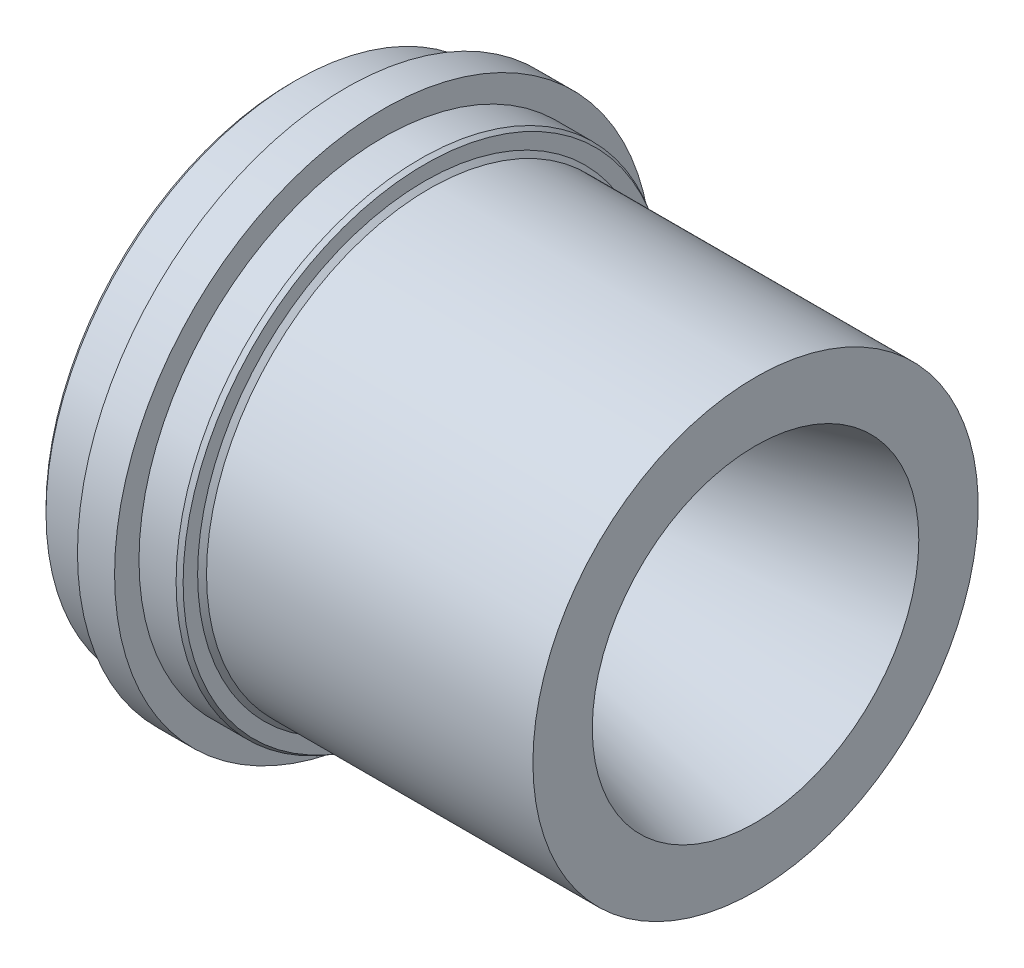
ISO-10303-21;
HEADER;
FILE_DESCRIPTION(('STEP AP214'),'2;1');
FILE_NAME('part.step','',(''),(''),'','','');
FILE_SCHEMA(('AUTOMOTIVE_DESIGN { 1 0 10303 214 1 1 1 1 }'));
ENDSEC;
DATA;
#1=APPLICATION_CONTEXT('core data for automotive mechanical design processes');
#2=APPLICATION_PROTOCOL_DEFINITION('international standard','automotive_design',2000,#1);
#3=PRODUCT_CONTEXT('',#1,'mechanical');
#4=PRODUCT('Part','Part','',(#3));
#5=PRODUCT_RELATED_PRODUCT_CATEGORY('part','',(#4));
#6=PRODUCT_DEFINITION_FORMATION('','',#4);
#7=PRODUCT_DEFINITION_CONTEXT('part definition',#1,'design');
#8=PRODUCT_DEFINITION('design','',#6,#7);
#9=PRODUCT_DEFINITION_SHAPE('','',#8);
#10=(LENGTH_UNIT() NAMED_UNIT(*) SI_UNIT(.MILLI.,.METRE.));
#11=(NAMED_UNIT(*) PLANE_ANGLE_UNIT() SI_UNIT($,.RADIAN.));
#12=(NAMED_UNIT(*) SI_UNIT($,.STERADIAN.) SOLID_ANGLE_UNIT());
#13=UNCERTAINTY_MEASURE_WITH_UNIT(LENGTH_MEASURE(1.E-05),#10,'distance_accuracy_value','');
#14=(GEOMETRIC_REPRESENTATION_CONTEXT(3) GLOBAL_UNCERTAINTY_ASSIGNED_CONTEXT((#13)) GLOBAL_UNIT_ASSIGNED_CONTEXT((#10,
#11,#12)) REPRESENTATION_CONTEXT('',''));
#15=CARTESIAN_POINT('',(0.,0.,0.));
#16=DIRECTION('',(0.,0.,1.));
#17=DIRECTION('',(1.,0.,0.));
#18=AXIS2_PLACEMENT_3D('',#15,#16,#17);
#19=CARTESIAN_POINT('',(0.,0.,0.));
#20=DIRECTION('',(-1.,0.,0.));
#21=DIRECTION('',(0.,0.,1.));
#22=AXIS2_PLACEMENT_3D('',#19,#20,#21);
#23=CONICAL_SURFACE('',#22,36.4109,1.04719755119659);
#24=CARTESIAN_POINT('',(10.0663985254501,0.,0.));
#25=DIRECTION('',(-1.,0.,0.));
#26=DIRECTION('',(0.,0.,1.));
#27=AXIS2_PLACEMENT_3D('',#24,#25,#26);
#28=CIRCLE('',#27,18.9753863046842);
#29=CARTESIAN_POINT('',(10.0663985254501,0.,18.9753863046842));
#30=VERTEX_POINT('',#29);
#31=EDGE_CURVE('E43',#30,#30,#28,.T.);
#32=ORIENTED_EDGE('',*,*,#31,.F.);
#33=EDGE_LOOP('',(#32));
#34=FACE_BOUND('',#33,.T.);
#35=CARTESIAN_POINT('',(0.,0.,0.));
#36=DIRECTION('',(-1.,0.,0.));
#37=DIRECTION('',(0.,0.,1.));
#38=AXIS2_PLACEMENT_3D('',#35,#36,#37);
#39=CIRCLE('',#38,36.4109);
#40=CARTESIAN_POINT('',(0.,0.,36.4109));
#41=VERTEX_POINT('',#40);
#42=EDGE_CURVE('E83',#41,#41,#39,.T.);
#43=ORIENTED_EDGE('',*,*,#42,.T.);
#44=EDGE_LOOP('',(#43));
#45=FACE_BOUND('',#44,.T.);
#46=ADVANCED_FACE('F37',(#34,#45),#23,.F.);
#47=CARTESIAN_POINT('',(21.0649211535124,0.,0.));
#48=DIRECTION('',(-1.,0.,0.));
#49=DIRECTION('',(0.,0.,1.));
#50=AXIS2_PLACEMENT_3D('',#47,#48,#49);
#51=TOROIDAL_SURFACE('',#50,25.3253863046843,12.7);
#52=CARTESIAN_POINT('',(22.6314,0.,0.));
#53=DIRECTION('',(-1.,0.,0.));
#54=DIRECTION('',(0.,0.,1.));
#55=AXIS2_PLACEMENT_3D('',#52,#53,#54);
#56=CIRCLE('',#55,12.7223650786644);
#57=CARTESIAN_POINT('',(22.6314,0.,12.7223650786644));
#58=VERTEX_POINT('',#57);
#59=EDGE_CURVE('E47',#58,#58,#56,.T.);
#60=ORIENTED_EDGE('',*,*,#59,.F.);
#61=EDGE_LOOP('',(#60));
#62=FACE_BOUND('',#61,.T.);
#63=ORIENTED_EDGE('',*,*,#31,.T.);
#64=EDGE_LOOP('',(#63));
#65=FACE_BOUND('',#64,.T.);
#66=ADVANCED_FACE('F106',(#62,#65),#51,.T.);
#67=CARTESIAN_POINT('',(22.6314,0.,0.));
#68=DIRECTION('',(1.,0.,0.));
#69=DIRECTION('',(0.,0.,-1.));
#70=AXIS2_PLACEMENT_3D('',#67,#68,#69);
#71=CONICAL_SURFACE('',#70,12.7223650786644,0.261799387799143);
#72=CARTESIAN_POINT('',(79.4243866974604,0.,0.));
#73=DIRECTION('',(-1.,0.,0.));
#74=DIRECTION('',(0.,0.,1.));
#75=AXIS2_PLACEMENT_3D('',#72,#73,#74);
#76=CIRCLE('',#75,27.94);
#77=CARTESIAN_POINT('',(79.4243866974604,0.,27.94));
#78=VERTEX_POINT('',#77);
#79=EDGE_CURVE('E86',#78,#78,#76,.F.);
#80=ORIENTED_EDGE('',*,*,#79,.T.);
#81=EDGE_LOOP('',(#80));
#82=FACE_BOUND('',#81,.T.);
#83=ORIENTED_EDGE('',*,*,#59,.T.);
#84=EDGE_LOOP('',(#83));
#85=FACE_BOUND('',#84,.T.);
#86=ADVANCED_FACE('F90',(#82,#85),#71,.F.);
#87=CARTESIAN_POINT('',(0.,0.,0.));
#88=DIRECTION('',(-1.,0.,0.));
#89=DIRECTION('',(0.,0.,1.));
#90=AXIS2_PLACEMENT_3D('',#87,#88,#89);
#91=CYLINDRICAL_SURFACE('',#90,38.1);
#92=CARTESIAN_POINT('',(23.5712,0.,0.));
#93=DIRECTION('',(-1.,0.,0.));
#94=DIRECTION('',(0.,0.,1.));
#95=AXIS2_PLACEMENT_3D('',#92,#93,#94);
#96=CIRCLE('',#95,38.1);
#97=CARTESIAN_POINT('',(23.5712,0.,38.1));
#98=VERTEX_POINT('',#97);
#99=EDGE_CURVE('E51',#98,#98,#96,.T.);
#100=ORIENTED_EDGE('',*,*,#99,.F.);
#101=EDGE_LOOP('',(#100));
#102=FACE_BOUND('',#101,.T.);
#103=CARTESIAN_POINT('',(79.4243866974604,0.,0.));
#104=DIRECTION('',(-1.,0.,0.));
#105=DIRECTION('',(0.,0.,1.));
#106=AXIS2_PLACEMENT_3D('',#103,#104,#105);
#107=CIRCLE('',#106,38.1);
#108=CARTESIAN_POINT('',(79.4243866974604,0.,38.1));
#109=VERTEX_POINT('',#108);
#110=EDGE_CURVE('E10',#109,#109,#107,.T.);
#111=ORIENTED_EDGE('',*,*,#110,.T.);
#112=EDGE_LOOP('',(#111));
#113=FACE_BOUND('',#112,.T.);
#114=ADVANCED_FACE('F167',(#102,#113),#91,.T.);
#115=CARTESIAN_POINT('',(23.5712,0.,0.));
#116=DIRECTION('',(-1.,0.,0.));
#117=DIRECTION('',(0.,0.,1.));
#118=AXIS2_PLACEMENT_3D('',#115,#116,#117);
#119=CONICAL_SURFACE('',#118,38.1,0.785398163397448);
#120=CARTESIAN_POINT('',(22.8092,0.,0.));
#121=DIRECTION('',(-1.,0.,0.));
#122=DIRECTION('',(0.,0.,1.));
#123=AXIS2_PLACEMENT_3D('',#120,#121,#122);
#124=CIRCLE('',#123,38.862);
#125=CARTESIAN_POINT('',(22.8092,0.,38.862));
#126=VERTEX_POINT('',#125);
#127=EDGE_CURVE('E56',#126,#126,#124,.T.);
#128=ORIENTED_EDGE('',*,*,#127,.F.);
#129=EDGE_LOOP('',(#128));
#130=FACE_BOUND('',#129,.T.);
#131=ORIENTED_EDGE('',*,*,#99,.T.);
#132=EDGE_LOOP('',(#131));
#133=FACE_BOUND('',#132,.T.);
#134=ADVANCED_FACE('F161',(#130,#133),#119,.T.);
#135=CARTESIAN_POINT('',(22.8092,41.3430590948775,0.));
#136=DIRECTION('',(-1.,0.,0.));
#137=DIRECTION('',(0.,0.,1.));
#138=AXIS2_PLACEMENT_3D('',#135,#136,#137);
#139=PLANE('',#138);
#140=CARTESIAN_POINT('',(22.8092,0.,0.));
#141=DIRECTION('',(-1.,0.,0.));
#142=DIRECTION('',(0.,0.,1.));
#143=AXIS2_PLACEMENT_3D('',#140,#141,#142);
#144=CIRCLE('',#143,41.3430590948775);
#145=CARTESIAN_POINT('',(22.8092,0.,41.3430590948775));
#146=VERTEX_POINT('',#145);
#147=EDGE_CURVE('E59',#146,#146,#144,.T.);
#148=ORIENTED_EDGE('',*,*,#147,.F.);
#149=EDGE_LOOP('',(#148));
#150=FACE_BOUND('',#149,.T.);
#151=ORIENTED_EDGE('',*,*,#127,.T.);
#152=EDGE_LOOP('',(#151));
#153=FACE_BOUND('',#152,.T.);
#154=ADVANCED_FACE('F155',(#150,#153),#139,.F.);
#155=CARTESIAN_POINT('',(22.8092,0.,0.));
#156=DIRECTION('',(-1.,0.,0.));
#157=DIRECTION('',(0.,0.,1.));
#158=AXIS2_PLACEMENT_3D('',#155,#156,#157);
#159=CONICAL_SURFACE('',#158,41.3430590948775,0.523598775598299);
#160=CARTESIAN_POINT('',(22.0472,0.,0.));
#161=DIRECTION('',(-1.,0.,0.));
#162=DIRECTION('',(0.,0.,1.));
#163=AXIS2_PLACEMENT_3D('',#160,#161,#162);
#164=CIRCLE('',#163,41.783);
#165=CARTESIAN_POINT('',(22.0472,0.,41.783));
#166=VERTEX_POINT('',#165);
#167=EDGE_CURVE('E62',#166,#166,#164,.T.);
#168=ORIENTED_EDGE('',*,*,#167,.F.);
#169=EDGE_LOOP('',(#168));
#170=FACE_BOUND('',#169,.T.);
#171=ORIENTED_EDGE('',*,*,#147,.T.);
#172=EDGE_LOOP('',(#171));
#173=FACE_BOUND('',#172,.T.);
#174=ADVANCED_FACE('F149',(#170,#173),#159,.T.);
#175=CARTESIAN_POINT('',(0.,0.,0.));
#176=DIRECTION('',(-1.,0.,0.));
#177=DIRECTION('',(0.,0.,1.));
#178=AXIS2_PLACEMENT_3D('',#175,#176,#177);
#179=CYLINDRICAL_SURFACE('',#178,41.783);
#180=CARTESIAN_POINT('',(15.6972,0.,0.));
#181=DIRECTION('',(-1.,0.,0.));
#182=DIRECTION('',(0.,0.,1.));
#183=AXIS2_PLACEMENT_3D('',#180,#181,#182);
#184=CIRCLE('',#183,41.783);
#185=CARTESIAN_POINT('',(15.6972,0.,41.783));
#186=VERTEX_POINT('',#185);
#187=EDGE_CURVE('E65',#186,#186,#184,.T.);
#188=ORIENTED_EDGE('',*,*,#187,.F.);
#189=EDGE_LOOP('',(#188));
#190=FACE_BOUND('',#189,.T.);
#191=ORIENTED_EDGE('',*,*,#167,.T.);
#192=EDGE_LOOP('',(#191));
#193=FACE_BOUND('',#192,.T.);
#194=ADVANCED_FACE('F143',(#190,#193),#179,.T.);
#195=CARTESIAN_POINT('',(15.6972,45.9613,0.));
#196=DIRECTION('',(-1.,0.,0.));
#197=DIRECTION('',(0.,0.,1.));
#198=AXIS2_PLACEMENT_3D('',#195,#196,#197);
#199=PLANE('',#198);
#200=CARTESIAN_POINT('',(15.6972,0.,0.));
#201=DIRECTION('',(-1.,0.,0.));
#202=DIRECTION('',(0.,0.,1.));
#203=AXIS2_PLACEMENT_3D('',#200,#201,#202);
#204=CIRCLE('',#203,45.9613);
#205=CARTESIAN_POINT('',(15.6972,0.,45.9613));
#206=VERTEX_POINT('',#205);
#207=EDGE_CURVE('E68',#206,#206,#204,.T.);
#208=ORIENTED_EDGE('',*,*,#207,.F.);
#209=EDGE_LOOP('',(#208));
#210=FACE_BOUND('',#209,.T.);
#211=ORIENTED_EDGE('',*,*,#187,.T.);
#212=EDGE_LOOP('',(#211));
#213=FACE_BOUND('',#212,.T.);
#214=ADVANCED_FACE('F137',(#210,#213),#199,.F.);
#215=CARTESIAN_POINT('',(0.,0.,0.));
#216=DIRECTION('',(-1.,0.,0.));
#217=DIRECTION('',(0.,0.,1.));
#218=AXIS2_PLACEMENT_3D('',#215,#216,#217);
#219=CYLINDRICAL_SURFACE('',#218,45.9613);
#220=CARTESIAN_POINT('',(9.34719999999998,0.,0.));
#221=DIRECTION('',(-1.,0.,0.));
#222=DIRECTION('',(0.,0.,1.));
#223=AXIS2_PLACEMENT_3D('',#220,#221,#222);
#224=CIRCLE('',#223,45.9613);
#225=CARTESIAN_POINT('',(9.34719999999998,0.,45.9613));
#226=VERTEX_POINT('',#225);
#227=EDGE_CURVE('E71',#226,#226,#224,.T.);
#228=ORIENTED_EDGE('',*,*,#227,.F.);
#229=EDGE_LOOP('',(#228));
#230=FACE_BOUND('',#229,.T.);
#231=ORIENTED_EDGE('',*,*,#207,.T.);
#232=EDGE_LOOP('',(#231));
#233=FACE_BOUND('',#232,.T.);
#234=ADVANCED_FACE('F131',(#230,#233),#219,.T.);
#235=CARTESIAN_POINT('',(9.34719999999998,42.7609,0.));
#236=DIRECTION('',(1.,0.,0.));
#237=DIRECTION('',(0.,0.,-1.));
#238=AXIS2_PLACEMENT_3D('',#235,#236,#237);
#239=PLANE('',#238);
#240=CARTESIAN_POINT('',(9.34719999999998,0.,0.));
#241=DIRECTION('',(-1.,0.,0.));
#242=DIRECTION('',(0.,0.,1.));
#243=AXIS2_PLACEMENT_3D('',#240,#241,#242);
#244=CIRCLE('',#243,42.7609);
#245=CARTESIAN_POINT('',(9.34719999999998,0.,42.7609));
#246=VERTEX_POINT('',#245);
#247=EDGE_CURVE('E74',#246,#246,#244,.T.);
#248=ORIENTED_EDGE('',*,*,#247,.F.);
#249=EDGE_LOOP('',(#248));
#250=FACE_BOUND('',#249,.T.);
#251=ORIENTED_EDGE('',*,*,#227,.T.);
#252=EDGE_LOOP('',(#251));
#253=FACE_BOUND('',#252,.T.);
#254=ADVANCED_FACE('F125',(#250,#253),#239,.F.);
#255=CARTESIAN_POINT('',(0.,0.,0.));
#256=DIRECTION('',(-1.,0.,0.));
#257=DIRECTION('',(0.,0.,1.));
#258=AXIS2_PLACEMENT_3D('',#255,#256,#257);
#259=CYLINDRICAL_SURFACE('',#258,42.7609);
#260=CARTESIAN_POINT('',(0.761999999999997,0.,0.));
#261=DIRECTION('',(-1.,0.,0.));
#262=DIRECTION('',(0.,0.,1.));
#263=AXIS2_PLACEMENT_3D('',#260,#261,#262);
#264=CIRCLE('',#263,42.7609);
#265=CARTESIAN_POINT('',(0.761999999999997,0.,42.7609));
#266=VERTEX_POINT('',#265);
#267=EDGE_CURVE('E77',#266,#266,#264,.T.);
#268=ORIENTED_EDGE('',*,*,#267,.F.);
#269=EDGE_LOOP('',(#268));
#270=FACE_BOUND('',#269,.T.);
#271=ORIENTED_EDGE('',*,*,#247,.T.);
#272=EDGE_LOOP('',(#271));
#273=FACE_BOUND('',#272,.T.);
#274=ADVANCED_FACE('F119',(#270,#273),#259,.T.);
#275=CARTESIAN_POINT('',(0.761999999999997,0.,0.));
#276=DIRECTION('',(1.,0.,0.));
#277=DIRECTION('',(0.,0.,-1.));
#278=AXIS2_PLACEMENT_3D('',#275,#276,#277);
#279=CONICAL_SURFACE('',#278,42.7609,0.78539816339745);
#280=CARTESIAN_POINT('',(0.,0.,0.));
#281=DIRECTION('',(-1.,0.,0.));
#282=DIRECTION('',(0.,0.,1.));
#283=AXIS2_PLACEMENT_3D('',#280,#281,#282);
#284=CIRCLE('',#283,41.9989);
#285=CARTESIAN_POINT('',(0.,0.,41.9989));
#286=VERTEX_POINT('',#285);
#287=EDGE_CURVE('E80',#286,#286,#284,.T.);
#288=ORIENTED_EDGE('',*,*,#287,.F.);
#289=EDGE_LOOP('',(#288));
#290=FACE_BOUND('',#289,.T.);
#291=ORIENTED_EDGE('',*,*,#267,.T.);
#292=EDGE_LOOP('',(#291));
#293=FACE_BOUND('',#292,.T.);
#294=ADVANCED_FACE('F102',(#290,#293),#279,.T.);
#295=CARTESIAN_POINT('',(0.,36.4109,0.));
#296=DIRECTION('',(1.,0.,0.));
#297=DIRECTION('',(0.,0.,-1.));
#298=AXIS2_PLACEMENT_3D('',#295,#296,#297);
#299=PLANE('',#298);
#300=ORIENTED_EDGE('',*,*,#42,.F.);
#301=EDGE_LOOP('',(#300));
#302=FACE_BOUND('',#301,.T.);
#303=ORIENTED_EDGE('',*,*,#287,.T.);
#304=EDGE_LOOP('',(#303));
#305=FACE_BOUND('',#304,.T.);
#306=ADVANCED_FACE('F95',(#302,#305),#299,.F.);
#307=CARTESIAN_POINT('',(79.4243866974604,-38.1,-45.9613));
#308=DIRECTION('',(-1.,0.,0.));
#309=DIRECTION('',(0.,0.,1.));
#310=AXIS2_PLACEMENT_3D('',#307,#308,#309);
#311=PLANE('',#310);
#312=ORIENTED_EDGE('',*,*,#110,.F.);
#313=EDGE_LOOP('',(#312));
#314=FACE_BOUND('',#313,.T.);
#315=ORIENTED_EDGE('',*,*,#79,.F.);
#316=EDGE_LOOP('',(#315));
#317=FACE_BOUND('',#316,.T.);
#318=ADVANCED_FACE('F93',(#314,#317),#311,.F.);
#319=CLOSED_SHELL('',(#46,#66,#86,#114,#134,#154,#174,#194,#214,#234,#254,#274,#294,#306,#318));
#320=MANIFOLD_SOLID_BREP('B2',#319);
#321=ADVANCED_BREP_SHAPE_REPRESENTATION('',(#18,#320),#14);
#322=SHAPE_DEFINITION_REPRESENTATION(#9,#321);
ENDSEC;
END-ISO-10303-21;
